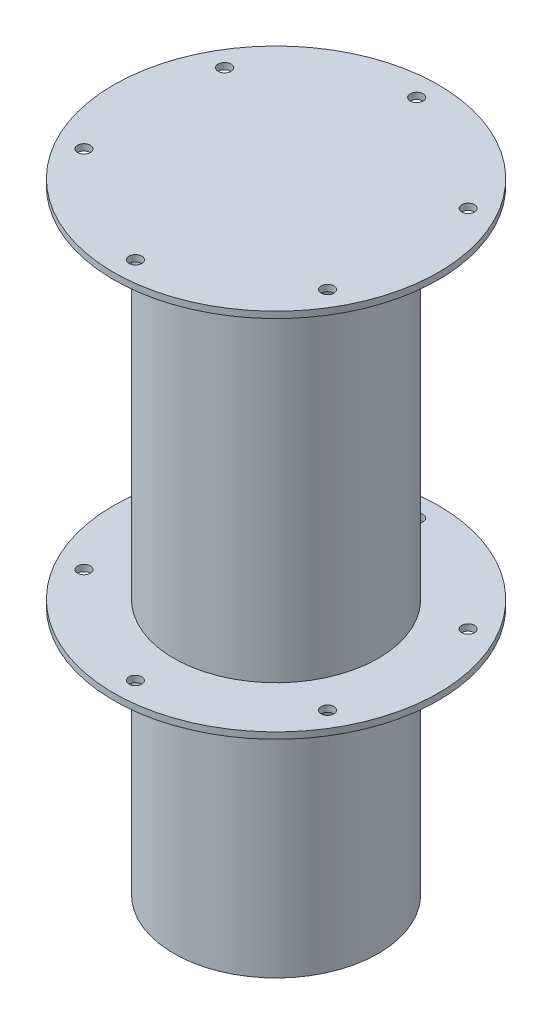
ISO-10303-21;
HEADER;
FILE_DESCRIPTION(('STEP AP214'),'2;1');
FILE_NAME('part.step','',(''),(''),'','','');
FILE_SCHEMA(('AUTOMOTIVE_DESIGN { 1 0 10303 214 1 1 1 1 }'));
ENDSEC;
DATA;
#1=APPLICATION_CONTEXT('core data for automotive mechanical design processes');
#2=APPLICATION_PROTOCOL_DEFINITION('international standard','automotive_design',2000,#1);
#3=PRODUCT_CONTEXT('',#1,'mechanical');
#4=PRODUCT('Part','Part','',(#3));
#5=PRODUCT_RELATED_PRODUCT_CATEGORY('part','',(#4));
#6=PRODUCT_DEFINITION_FORMATION('','',#4);
#7=PRODUCT_DEFINITION_CONTEXT('part definition',#1,'design');
#8=PRODUCT_DEFINITION('design','',#6,#7);
#9=PRODUCT_DEFINITION_SHAPE('','',#8);
#10=(LENGTH_UNIT() NAMED_UNIT(*) SI_UNIT(.MILLI.,.METRE.));
#11=(NAMED_UNIT(*) PLANE_ANGLE_UNIT() SI_UNIT($,.RADIAN.));
#12=(NAMED_UNIT(*) SI_UNIT($,.STERADIAN.) SOLID_ANGLE_UNIT());
#13=UNCERTAINTY_MEASURE_WITH_UNIT(LENGTH_MEASURE(1.E-05),#10,'distance_accuracy_value','');
#14=(GEOMETRIC_REPRESENTATION_CONTEXT(3) GLOBAL_UNCERTAINTY_ASSIGNED_CONTEXT((#13)) GLOBAL_UNIT_ASSIGNED_CONTEXT((#10,
#11,#12)) REPRESENTATION_CONTEXT('',''));
#15=CARTESIAN_POINT('',(0.,0.,0.));
#16=DIRECTION('',(0.,0.,1.));
#17=DIRECTION('',(1.,0.,0.));
#18=AXIS2_PLACEMENT_3D('',#15,#16,#17);
#19=CARTESIAN_POINT('',(0.,324.959176799148,0.));
#20=DIRECTION('',(0.,-1.,0.));
#21=DIRECTION('',(1.,0.,0.));
#22=AXIS2_PLACEMENT_3D('',#19,#20,#21);
#23=PLANE('',#22);
#24=CARTESIAN_POINT('',(120.983748908698,324.959176799148,69.8499999999931));
#25=DIRECTION('',(0.,1.,0.));
#26=DIRECTION('',(-1.,0.,0.));
#27=AXIS2_PLACEMENT_3D('',#24,#25,#26);
#28=CIRCLE('',#27,6.35000000001);
#29=CARTESIAN_POINT('',(114.633748908688,324.959176799148,69.8499999999931));
#30=VERTEX_POINT('',#29);
#31=EDGE_CURVE('E157',#30,#30,#28,.T.);
#32=ORIENTED_EDGE('',*,*,#31,.F.);
#33=EDGE_LOOP('',(#32));
#34=FACE_BOUND('',#33,.T.);
#35=CARTESIAN_POINT('',(1.58080385765695E-11,324.959176799148,139.7));
#36=DIRECTION('',(0.,1.,0.));
#37=DIRECTION('',(-1.,0.,0.));
#38=AXIS2_PLACEMENT_3D('',#35,#36,#37);
#39=CIRCLE('',#38,6.35000000001608);
#40=CARTESIAN_POINT('',(-6.35000000000027,324.959176799148,139.7));
#41=VERTEX_POINT('',#40);
#42=EDGE_CURVE('E70',#41,#41,#39,.T.);
#43=ORIENTED_EDGE('',*,*,#42,.F.);
#44=EDGE_LOOP('',(#43));
#45=FACE_BOUND('',#44,.T.);
#46=CARTESIAN_POINT('',(-120.983748908674,324.959176799148,69.8500000000069));
#47=DIRECTION('',(0.,1.,0.));
#48=DIRECTION('',(-1.,0.,0.));
#49=AXIS2_PLACEMENT_3D('',#46,#47,#48);
#50=CIRCLE('',#49,6.35000000001463);
#51=CARTESIAN_POINT('',(-127.333748908689,324.959176799148,69.8500000000069));
#52=VERTEX_POINT('',#51);
#53=EDGE_CURVE('E66',#52,#52,#50,.T.);
#54=ORIENTED_EDGE('',*,*,#53,.F.);
#55=EDGE_LOOP('',(#54));
#56=FACE_BOUND('',#55,.T.);
#57=CARTESIAN_POINT('',(0.,324.959176799148,-139.7));
#58=DIRECTION('',(0.,1.,0.));
#59=DIRECTION('',(-1.,0.,0.));
#60=AXIS2_PLACEMENT_3D('',#57,#58,#59);
#61=CIRCLE('',#60,6.35);
#62=CARTESIAN_POINT('',(-6.35000000000004,324.959176799148,-139.7));
#63=VERTEX_POINT('',#62);
#64=EDGE_CURVE('E62',#63,#63,#61,.T.);
#65=ORIENTED_EDGE('',*,*,#64,.F.);
#66=EDGE_LOOP('',(#65));
#67=FACE_BOUND('',#66,.T.);
#68=CARTESIAN_POINT('',(120.98374890869,324.959176799148,-69.8500000000069));
#69=DIRECTION('',(0.,1.,0.));
#70=DIRECTION('',(-1.,0.,0.));
#71=AXIS2_PLACEMENT_3D('',#68,#69,#70);
#72=CIRCLE('',#71,6.35000000000213);
#73=CARTESIAN_POINT('',(114.633748908688,324.959176799148,-69.8500000000069));
#74=VERTEX_POINT('',#73);
#75=EDGE_CURVE('E57',#74,#74,#72,.T.);
#76=ORIENTED_EDGE('',*,*,#75,.F.);
#77=EDGE_LOOP('',(#76));
#78=FACE_BOUND('',#77,.T.);
#79=CARTESIAN_POINT('',(-120.983748908682,324.959176799148,-69.849999999993));
#80=DIRECTION('',(0.,1.,0.));
#81=DIRECTION('',(-1.,0.,0.));
#82=AXIS2_PLACEMENT_3D('',#79,#80,#81);
#83=CIRCLE('',#82,6.35000000000746);
#84=CARTESIAN_POINT('',(-127.33374890869,324.959176799148,-69.849999999993));
#85=VERTEX_POINT('',#84);
#86=EDGE_CURVE('E52',#85,#85,#83,.T.);
#87=ORIENTED_EDGE('',*,*,#86,.F.);
#88=EDGE_LOOP('',(#87));
#89=FACE_BOUND('',#88,.T.);
#90=CARTESIAN_POINT('',(0.,324.959176799149,0.));
#91=DIRECTION('',(0.,1.,0.));
#92=DIRECTION('',(-1.,0.,0.));
#93=AXIS2_PLACEMENT_3D('',#90,#91,#92);
#94=CIRCLE('',#93,161.358198728357);
#95=CARTESIAN_POINT('',(-161.358198728357,324.959176799149,0.));
#96=VERTEX_POINT('',#95);
#97=EDGE_CURVE('E116',#96,#96,#94,.T.);
#98=ORIENTED_EDGE('',*,*,#97,.T.);
#99=EDGE_LOOP('',(#98));
#100=FACE_BOUND('',#99,.T.);
#101=ADVANCED_FACE('F32',(#34,#45,#56,#67,#78,#89,#100),#23,.F.);
#102=CARTESIAN_POINT('',(-1.58988539307192E-13,-290.990823200851,0.));
#103=DIRECTION('',(0.,-1.,0.));
#104=DIRECTION('',(1.,0.,0.));
#105=AXIS2_PLACEMENT_3D('',#102,#103,#104);
#106=PLANE('',#105);
#107=CARTESIAN_POINT('',(0.,-290.990823200851,0.));
#108=DIRECTION('',(0.,1.,0.));
#109=DIRECTION('',(-1.,0.,0.));
#110=AXIS2_PLACEMENT_3D('',#107,#108,#109);
#111=CIRCLE('',#110,101.6);
#112=CARTESIAN_POINT('',(-101.6,-290.990823200851,0.));
#113=VERTEX_POINT('',#112);
#114=EDGE_CURVE('E10',#113,#113,#111,.T.);
#115=ORIENTED_EDGE('',*,*,#114,.F.);
#116=EDGE_LOOP('',(#115));
#117=FACE_BOUND('',#116,.T.);
#118=ADVANCED_FACE('F144',(#117),#106,.T.);
#119=CARTESIAN_POINT('',(0.,318.609176799148,0.));
#120=DIRECTION('',(0.,1.,0.));
#121=DIRECTION('',(-1.,0.,0.));
#122=AXIS2_PLACEMENT_3D('',#119,#120,#121);
#123=CYLINDRICAL_SURFACE('',#122,101.6);
#124=ORIENTED_EDGE('',*,*,#114,.T.);
#125=EDGE_LOOP('',(#124));
#126=FACE_BOUND('',#125,.T.);
#127=CARTESIAN_POINT('',(0.,-43.3408232008515,0.));
#128=DIRECTION('',(0.,1.,0.));
#129=DIRECTION('',(-1.,0.,0.));
#130=AXIS2_PLACEMENT_3D('',#127,#128,#129);
#131=CIRCLE('',#130,101.6);
#132=CARTESIAN_POINT('',(-101.6,-43.3408232008515,0.));
#133=VERTEX_POINT('',#132);
#134=EDGE_CURVE('E39',#133,#133,#131,.T.);
#135=ORIENTED_EDGE('',*,*,#134,.F.);
#136=EDGE_LOOP('',(#135));
#137=FACE_BOUND('',#136,.T.);
#138=ADVANCED_FACE('F138',(#126,#137),#123,.T.);
#139=CARTESIAN_POINT('',(0.,-43.3408232008515,0.));
#140=DIRECTION('',(0.,1.,0.));
#141=DIRECTION('',(-1.,0.,0.));
#142=AXIS2_PLACEMENT_3D('',#139,#140,#141);
#143=PLANE('',#142);
#144=CARTESIAN_POINT('',(120.983748908698,-43.3408232008515,69.8499999999931));
#145=DIRECTION('',(0.,1.,0.));
#146=DIRECTION('',(-1.,0.,0.));
#147=AXIS2_PLACEMENT_3D('',#144,#145,#146);
#148=CIRCLE('',#147,6.35000000001);
#149=CARTESIAN_POINT('',(114.633748908688,-43.3408232008515,69.8499999999931));
#150=VERTEX_POINT('',#149);
#151=EDGE_CURVE('E77',#150,#150,#148,.T.);
#152=ORIENTED_EDGE('',*,*,#151,.T.);
#153=EDGE_LOOP('',(#152));
#154=FACE_BOUND('',#153,.T.);
#155=CARTESIAN_POINT('',(1.58531423181821E-11,-43.3408232008515,139.7));
#156=DIRECTION('',(0.,1.,0.));
#157=DIRECTION('',(-1.,0.,0.));
#158=AXIS2_PLACEMENT_3D('',#155,#156,#157);
#159=CIRCLE('',#158,6.35000000001608);
#160=CARTESIAN_POINT('',(-6.35000000000023,-43.3408232008515,139.7));
#161=VERTEX_POINT('',#160);
#162=EDGE_CURVE('E74',#161,#161,#159,.T.);
#163=ORIENTED_EDGE('',*,*,#162,.T.);
#164=EDGE_LOOP('',(#163));
#165=FACE_BOUND('',#164,.T.);
#166=CARTESIAN_POINT('',(-120.983748908674,-43.3408232008515,69.8500000000069));
#167=DIRECTION('',(0.,1.,0.));
#168=DIRECTION('',(-1.,0.,0.));
#169=AXIS2_PLACEMENT_3D('',#166,#167,#168);
#170=CIRCLE('',#169,6.35000000001463);
#171=CARTESIAN_POINT('',(-127.333748908689,-43.3408232008515,69.8500000000069));
#172=VERTEX_POINT('',#171);
#173=EDGE_CURVE('E92',#172,#172,#170,.T.);
#174=ORIENTED_EDGE('',*,*,#173,.T.);
#175=EDGE_LOOP('',(#174));
#176=FACE_BOUND('',#175,.T.);
#177=CARTESIAN_POINT('',(0.,-43.3408232008515,-139.7));
#178=DIRECTION('',(0.,1.,0.));
#179=DIRECTION('',(-1.,0.,0.));
#180=AXIS2_PLACEMENT_3D('',#177,#178,#179);
#181=CIRCLE('',#180,6.35);
#182=CARTESIAN_POINT('',(-6.34999999999999,-43.3408232008515,-139.7));
#183=VERTEX_POINT('',#182);
#184=EDGE_CURVE('E99',#183,#183,#181,.T.);
#185=ORIENTED_EDGE('',*,*,#184,.T.);
#186=EDGE_LOOP('',(#185));
#187=FACE_BOUND('',#186,.T.);
#188=CARTESIAN_POINT('',(120.98374890869,-43.3408232008515,-69.8500000000069));
#189=DIRECTION('',(0.,1.,0.));
#190=DIRECTION('',(-1.,0.,0.));
#191=AXIS2_PLACEMENT_3D('',#188,#189,#190);
#192=CIRCLE('',#191,6.35000000000213);
#193=CARTESIAN_POINT('',(114.633748908688,-43.3408232008515,-69.8500000000069));
#194=VERTEX_POINT('',#193);
#195=EDGE_CURVE('E106',#194,#194,#192,.T.);
#196=ORIENTED_EDGE('',*,*,#195,.T.);
#197=EDGE_LOOP('',(#196));
#198=FACE_BOUND('',#197,.T.);
#199=CARTESIAN_POINT('',(-120.983748908682,-43.3408232008515,-69.849999999993));
#200=DIRECTION('',(0.,1.,0.));
#201=DIRECTION('',(-1.,0.,0.));
#202=AXIS2_PLACEMENT_3D('',#199,#200,#201);
#203=CIRCLE('',#202,6.35000000000746);
#204=CARTESIAN_POINT('',(-127.33374890869,-43.3408232008515,-69.849999999993));
#205=VERTEX_POINT('',#204);
#206=EDGE_CURVE('E113',#205,#205,#203,.T.);
#207=ORIENTED_EDGE('',*,*,#206,.T.);
#208=EDGE_LOOP('',(#207));
#209=FACE_BOUND('',#208,.T.);
#210=CARTESIAN_POINT('',(0.,-43.3408232008515,0.));
#211=DIRECTION('',(0.,1.,0.));
#212=DIRECTION('',(-1.,0.,0.));
#213=AXIS2_PLACEMENT_3D('',#210,#211,#212);
#214=CIRCLE('',#213,161.358198728357);
#215=CARTESIAN_POINT('',(-161.358198728357,-43.3408232008515,0.));
#216=VERTEX_POINT('',#215);
#217=EDGE_CURVE('E44',#216,#216,#214,.T.);
#218=ORIENTED_EDGE('',*,*,#217,.F.);
#219=EDGE_LOOP('',(#218));
#220=FACE_BOUND('',#219,.T.);
#221=ORIENTED_EDGE('',*,*,#134,.T.);
#222=EDGE_LOOP('',(#221));
#223=FACE_BOUND('',#222,.T.);
#224=ADVANCED_FACE('F135',(#154,#165,#176,#187,#198,#209,#220,#223),#143,.F.);
#225=CARTESIAN_POINT('',(0.,318.609176799148,0.));
#226=DIRECTION('',(0.,1.,0.));
#227=DIRECTION('',(-1.,0.,0.));
#228=AXIS2_PLACEMENT_3D('',#225,#226,#227);
#229=CYLINDRICAL_SURFACE('',#228,161.358198728357);
#230=CARTESIAN_POINT('',(0.,-36.9908232008515,0.));
#231=DIRECTION('',(0.,1.,0.));
#232=DIRECTION('',(-1.,0.,0.));
#233=AXIS2_PLACEMENT_3D('',#230,#231,#232);
#234=CIRCLE('',#233,161.358198728357);
#235=CARTESIAN_POINT('',(-161.358198728357,-36.9908232008515,0.));
#236=VERTEX_POINT('',#235);
#237=EDGE_CURVE('E128',#236,#236,#234,.T.);
#238=ORIENTED_EDGE('',*,*,#237,.F.);
#239=EDGE_LOOP('',(#238));
#240=FACE_BOUND('',#239,.T.);
#241=ORIENTED_EDGE('',*,*,#217,.T.);
#242=EDGE_LOOP('',(#241));
#243=FACE_BOUND('',#242,.T.);
#244=ADVANCED_FACE('F133',(#240,#243),#229,.T.);
#245=CARTESIAN_POINT('',(0.,-36.9908232008515,0.));
#246=DIRECTION('',(0.,-1.,0.));
#247=DIRECTION('',(1.,0.,0.));
#248=AXIS2_PLACEMENT_3D('',#245,#246,#247);
#249=PLANE('',#248);
#250=CARTESIAN_POINT('',(120.983748908698,-36.9908232008515,69.8499999999931));
#251=DIRECTION('',(0.,-1.,0.));
#252=DIRECTION('',(1.,0.,0.));
#253=AXIS2_PLACEMENT_3D('',#250,#251,#252);
#254=CIRCLE('',#253,6.35000000001);
#255=CARTESIAN_POINT('',(127.333748908708,-36.9908232008515,69.8499999999931));
#256=VERTEX_POINT('',#255);
#257=EDGE_CURVE('E82',#256,#256,#254,.T.);
#258=ORIENTED_EDGE('',*,*,#257,.T.);
#259=EDGE_LOOP('',(#258));
#260=FACE_BOUND('',#259,.T.);
#261=CARTESIAN_POINT('',(1.58523646674647E-11,-36.9908232008515,139.7));
#262=DIRECTION('',(0.,-1.,0.));
#263=DIRECTION('',(1.,0.,0.));
#264=AXIS2_PLACEMENT_3D('',#261,#262,#263);
#265=CIRCLE('',#264,6.35000000001608);
#266=CARTESIAN_POINT('',(6.35000000003193,-36.9908232008515,139.7));
#267=VERTEX_POINT('',#266);
#268=EDGE_CURVE('E69',#267,#267,#265,.T.);
#269=ORIENTED_EDGE('',*,*,#268,.T.);
#270=EDGE_LOOP('',(#269));
#271=FACE_BOUND('',#270,.T.);
#272=CARTESIAN_POINT('',(-120.983748908674,-36.9908232008515,69.8500000000069));
#273=DIRECTION('',(0.,-1.,0.));
#274=DIRECTION('',(1.,0.,0.));
#275=AXIS2_PLACEMENT_3D('',#272,#273,#274);
#276=CIRCLE('',#275,6.35000000001463);
#277=CARTESIAN_POINT('',(-114.63374890866,-36.9908232008515,69.8500000000069));
#278=VERTEX_POINT('',#277);
#279=EDGE_CURVE('E65',#278,#278,#276,.T.);
#280=ORIENTED_EDGE('',*,*,#279,.T.);
#281=EDGE_LOOP('',(#280));
#282=FACE_BOUND('',#281,.T.);
#283=CARTESIAN_POINT('',(0.,-36.9908232008515,-139.7));
#284=DIRECTION('',(0.,-1.,0.));
#285=DIRECTION('',(1.,0.,0.));
#286=AXIS2_PLACEMENT_3D('',#283,#284,#285);
#287=CIRCLE('',#286,6.35);
#288=CARTESIAN_POINT('',(6.35,-36.9908232008515,-139.7));
#289=VERTEX_POINT('',#288);
#290=EDGE_CURVE('E61',#289,#289,#287,.T.);
#291=ORIENTED_EDGE('',*,*,#290,.T.);
#292=EDGE_LOOP('',(#291));
#293=FACE_BOUND('',#292,.T.);
#294=CARTESIAN_POINT('',(120.98374890869,-36.9908232008515,-69.8500000000069));
#295=DIRECTION('',(0.,-1.,0.));
#296=DIRECTION('',(1.,0.,0.));
#297=AXIS2_PLACEMENT_3D('',#294,#295,#296);
#298=CIRCLE('',#297,6.35000000000213);
#299=CARTESIAN_POINT('',(127.333748908692,-36.9908232008515,-69.8500000000069));
#300=VERTEX_POINT('',#299);
#301=EDGE_CURVE('E56',#300,#300,#298,.T.);
#302=ORIENTED_EDGE('',*,*,#301,.T.);
#303=EDGE_LOOP('',(#302));
#304=FACE_BOUND('',#303,.T.);
#305=CARTESIAN_POINT('',(-120.983748908682,-36.9908232008515,-69.849999999993));
#306=DIRECTION('',(0.,-1.,0.));
#307=DIRECTION('',(1.,0.,0.));
#308=AXIS2_PLACEMENT_3D('',#305,#306,#307);
#309=CIRCLE('',#308,6.35000000000746);
#310=CARTESIAN_POINT('',(-114.633748908675,-36.9908232008515,-69.849999999993));
#311=VERTEX_POINT('',#310);
#312=EDGE_CURVE('E51',#311,#311,#309,.T.);
#313=ORIENTED_EDGE('',*,*,#312,.T.);
#314=EDGE_LOOP('',(#313));
#315=FACE_BOUND('',#314,.T.);
#316=CARTESIAN_POINT('',(0.,-36.9908232008515,0.));
#317=DIRECTION('',(0.,1.,0.));
#318=DIRECTION('',(-1.,0.,0.));
#319=AXIS2_PLACEMENT_3D('',#316,#317,#318);
#320=CIRCLE('',#319,101.6);
#321=CARTESIAN_POINT('',(-101.6,-36.9908232008515,0.));
#322=VERTEX_POINT('',#321);
#323=EDGE_CURVE('E125',#322,#322,#320,.T.);
#324=ORIENTED_EDGE('',*,*,#323,.F.);
#325=EDGE_LOOP('',(#324));
#326=FACE_BOUND('',#325,.T.);
#327=ORIENTED_EDGE('',*,*,#237,.T.);
#328=EDGE_LOOP('',(#327));
#329=FACE_BOUND('',#328,.T.);
#330=ADVANCED_FACE('F185',(#260,#271,#282,#293,#304,#315,#326,#329),#249,.F.);
#331=CARTESIAN_POINT('',(0.,318.609176799148,0.));
#332=DIRECTION('',(0.,1.,0.));
#333=DIRECTION('',(-1.,0.,0.));
#334=AXIS2_PLACEMENT_3D('',#331,#332,#333);
#335=CYLINDRICAL_SURFACE('',#334,101.6);
#336=ORIENTED_EDGE('',*,*,#323,.T.);
#337=EDGE_LOOP('',(#336));
#338=FACE_BOUND('',#337,.T.);
#339=CARTESIAN_POINT('',(0.,318.609176799148,0.));
#340=DIRECTION('',(0.,1.,0.));
#341=DIRECTION('',(-1.,0.,0.));
#342=AXIS2_PLACEMENT_3D('',#339,#340,#341);
#343=CIRCLE('',#342,101.6);
#344=CARTESIAN_POINT('',(-101.6,318.609176799148,0.));
#345=VERTEX_POINT('',#344);
#346=EDGE_CURVE('E122',#345,#345,#343,.T.);
#347=ORIENTED_EDGE('',*,*,#346,.F.);
#348=EDGE_LOOP('',(#347));
#349=FACE_BOUND('',#348,.T.);
#350=ADVANCED_FACE('F179',(#338,#349),#335,.T.);
#351=CARTESIAN_POINT('',(0.,318.609176799148,0.));
#352=DIRECTION('',(0.,1.,0.));
#353=DIRECTION('',(-1.,0.,0.));
#354=AXIS2_PLACEMENT_3D('',#351,#352,#353);
#355=PLANE('',#354);
#356=CARTESIAN_POINT('',(120.983748908698,318.609176799148,69.8499999999931));
#357=DIRECTION('',(0.,1.,0.));
#358=DIRECTION('',(-1.,0.,0.));
#359=AXIS2_PLACEMENT_3D('',#356,#357,#358);
#360=CIRCLE('',#359,6.35000000001);
#361=CARTESIAN_POINT('',(114.633748908688,318.609176799148,69.8499999999931));
#362=VERTEX_POINT('',#361);
#363=EDGE_CURVE('E35',#362,#362,#360,.T.);
#364=ORIENTED_EDGE('',*,*,#363,.T.);
#365=EDGE_LOOP('',(#364));
#366=FACE_BOUND('',#365,.T.);
#367=CARTESIAN_POINT('',(1.5808816227287E-11,318.609176799148,139.7));
#368=DIRECTION('',(0.,1.,0.));
#369=DIRECTION('',(-1.,0.,0.));
#370=AXIS2_PLACEMENT_3D('',#367,#368,#369);
#371=CIRCLE('',#370,6.35000000001608);
#372=CARTESIAN_POINT('',(-6.35000000000027,318.609176799148,139.7));
#373=VERTEX_POINT('',#372);
#374=EDGE_CURVE('E67',#373,#373,#371,.T.);
#375=ORIENTED_EDGE('',*,*,#374,.T.);
#376=EDGE_LOOP('',(#375));
#377=FACE_BOUND('',#376,.T.);
#378=CARTESIAN_POINT('',(-120.983748908674,318.609176799148,69.8500000000069));
#379=DIRECTION('',(0.,1.,0.));
#380=DIRECTION('',(-1.,0.,0.));
#381=AXIS2_PLACEMENT_3D('',#378,#379,#380);
#382=CIRCLE('',#381,6.35000000001463);
#383=CARTESIAN_POINT('',(-127.333748908689,318.609176799148,69.8500000000069));
#384=VERTEX_POINT('',#383);
#385=EDGE_CURVE('E63',#384,#384,#382,.T.);
#386=ORIENTED_EDGE('',*,*,#385,.T.);
#387=EDGE_LOOP('',(#386));
#388=FACE_BOUND('',#387,.T.);
#389=CARTESIAN_POINT('',(0.,318.609176799148,-139.7));
#390=DIRECTION('',(0.,1.,0.));
#391=DIRECTION('',(-1.,0.,0.));
#392=AXIS2_PLACEMENT_3D('',#389,#390,#391);
#393=CIRCLE('',#392,6.35);
#394=CARTESIAN_POINT('',(-6.35000000000004,318.609176799148,-139.7));
#395=VERTEX_POINT('',#394);
#396=EDGE_CURVE('E58',#395,#395,#393,.T.);
#397=ORIENTED_EDGE('',*,*,#396,.T.);
#398=EDGE_LOOP('',(#397));
#399=FACE_BOUND('',#398,.T.);
#400=CARTESIAN_POINT('',(120.98374890869,318.609176799148,-69.8500000000069));
#401=DIRECTION('',(0.,1.,0.));
#402=DIRECTION('',(-1.,0.,0.));
#403=AXIS2_PLACEMENT_3D('',#400,#401,#402);
#404=CIRCLE('',#403,6.35000000000213);
#405=CARTESIAN_POINT('',(114.633748908688,318.609176799148,-69.8500000000069));
#406=VERTEX_POINT('',#405);
#407=EDGE_CURVE('E53',#406,#406,#404,.T.);
#408=ORIENTED_EDGE('',*,*,#407,.T.);
#409=EDGE_LOOP('',(#408));
#410=FACE_BOUND('',#409,.T.);
#411=CARTESIAN_POINT('',(-120.983748908682,318.609176799148,-69.849999999993));
#412=DIRECTION('',(0.,1.,0.));
#413=DIRECTION('',(-1.,0.,0.));
#414=AXIS2_PLACEMENT_3D('',#411,#412,#413);
#415=CIRCLE('',#414,6.35000000000746);
#416=CARTESIAN_POINT('',(-127.33374890869,318.609176799148,-69.849999999993));
#417=VERTEX_POINT('',#416);
#418=EDGE_CURVE('E48',#417,#417,#415,.T.);
#419=ORIENTED_EDGE('',*,*,#418,.T.);
#420=EDGE_LOOP('',(#419));
#421=FACE_BOUND('',#420,.T.);
#422=CARTESIAN_POINT('',(0.,318.609176799148,0.));
#423=DIRECTION('',(0.,1.,0.));
#424=DIRECTION('',(-1.,0.,0.));
#425=AXIS2_PLACEMENT_3D('',#422,#423,#424);
#426=CIRCLE('',#425,161.358198728357);
#427=CARTESIAN_POINT('',(-161.358198728357,318.609176799148,0.));
#428=VERTEX_POINT('',#427);
#429=EDGE_CURVE('E119',#428,#428,#426,.T.);
#430=ORIENTED_EDGE('',*,*,#429,.F.);
#431=EDGE_LOOP('',(#430));
#432=FACE_BOUND('',#431,.T.);
#433=ORIENTED_EDGE('',*,*,#346,.T.);
#434=EDGE_LOOP('',(#433));
#435=FACE_BOUND('',#434,.T.);
#436=ADVANCED_FACE('F173',(#366,#377,#388,#399,#410,#421,#432,#435),#355,.F.);
#437=CARTESIAN_POINT('',(0.,318.609176799148,0.));
#438=DIRECTION('',(0.,1.,0.));
#439=DIRECTION('',(-1.,0.,0.));
#440=AXIS2_PLACEMENT_3D('',#437,#438,#439);
#441=CYLINDRICAL_SURFACE('',#440,161.358198728357);
#442=ORIENTED_EDGE('',*,*,#97,.F.);
#443=EDGE_LOOP('',(#442));
#444=FACE_BOUND('',#443,.T.);
#445=ORIENTED_EDGE('',*,*,#429,.T.);
#446=EDGE_LOOP('',(#445));
#447=FACE_BOUND('',#446,.T.);
#448=ADVANCED_FACE('F169',(#444,#447),#441,.T.);
#449=CARTESIAN_POINT('',(-120.983748908682,-290.990823200851,-69.849999999993));
#450=DIRECTION('',(0.,1.,0.));
#451=DIRECTION('',(-1.,0.,0.));
#452=AXIS2_PLACEMENT_3D('',#449,#450,#451);
#453=CYLINDRICAL_SURFACE('',#452,6.35000000000746);
#454=ORIENTED_EDGE('',*,*,#86,.T.);
#455=EDGE_LOOP('',(#454));
#456=FACE_BOUND('',#455,.T.);
#457=ORIENTED_EDGE('',*,*,#418,.F.);
#458=EDGE_LOOP('',(#457));
#459=FACE_BOUND('',#458,.T.);
#460=ADVANCED_FACE('F172',(#456,#459),#453,.F.);
#461=ORIENTED_EDGE('',*,*,#312,.F.);
#462=EDGE_LOOP('',(#461));
#463=FACE_BOUND('',#462,.T.);
#464=ORIENTED_EDGE('',*,*,#206,.F.);
#465=EDGE_LOOP('',(#464));
#466=FACE_BOUND('',#465,.T.);
#467=ADVANCED_FACE('F225',(#463,#466),#453,.F.);
#468=CARTESIAN_POINT('',(120.98374890869,-290.990823200851,-69.8500000000069));
#469=DIRECTION('',(0.,1.,0.));
#470=DIRECTION('',(-1.,0.,0.));
#471=AXIS2_PLACEMENT_3D('',#468,#469,#470);
#472=CYLINDRICAL_SURFACE('',#471,6.35000000000213);
#473=ORIENTED_EDGE('',*,*,#75,.T.);
#474=EDGE_LOOP('',(#473));
#475=FACE_BOUND('',#474,.T.);
#476=ORIENTED_EDGE('',*,*,#407,.F.);
#477=EDGE_LOOP('',(#476));
#478=FACE_BOUND('',#477,.T.);
#479=ADVANCED_FACE('F235',(#475,#478),#472,.F.);
#480=ORIENTED_EDGE('',*,*,#301,.F.);
#481=EDGE_LOOP('',(#480));
#482=FACE_BOUND('',#481,.T.);
#483=ORIENTED_EDGE('',*,*,#195,.F.);
#484=EDGE_LOOP('',(#483));
#485=FACE_BOUND('',#484,.T.);
#486=ADVANCED_FACE('F244',(#482,#485),#472,.F.);
#487=CARTESIAN_POINT('',(0.,-290.990823200851,-139.7));
#488=DIRECTION('',(0.,1.,0.));
#489=DIRECTION('',(-1.,0.,0.));
#490=AXIS2_PLACEMENT_3D('',#487,#488,#489);
#491=CYLINDRICAL_SURFACE('',#490,6.35);
#492=ORIENTED_EDGE('',*,*,#64,.T.);
#493=EDGE_LOOP('',(#492));
#494=FACE_BOUND('',#493,.T.);
#495=ORIENTED_EDGE('',*,*,#396,.F.);
#496=EDGE_LOOP('',(#495));
#497=FACE_BOUND('',#496,.T.);
#498=ADVANCED_FACE('F254',(#494,#497),#491,.F.);
#499=ORIENTED_EDGE('',*,*,#290,.F.);
#500=EDGE_LOOP('',(#499));
#501=FACE_BOUND('',#500,.T.);
#502=ORIENTED_EDGE('',*,*,#184,.F.);
#503=EDGE_LOOP('',(#502));
#504=FACE_BOUND('',#503,.T.);
#505=ADVANCED_FACE('F263',(#501,#504),#491,.F.);
#506=CARTESIAN_POINT('',(-120.983748908674,-290.990823200851,69.8500000000069));
#507=DIRECTION('',(0.,1.,0.));
#508=DIRECTION('',(-1.,0.,0.));
#509=AXIS2_PLACEMENT_3D('',#506,#507,#508);
#510=CYLINDRICAL_SURFACE('',#509,6.35000000001463);
#511=ORIENTED_EDGE('',*,*,#53,.T.);
#512=EDGE_LOOP('',(#511));
#513=FACE_BOUND('',#512,.T.);
#514=ORIENTED_EDGE('',*,*,#385,.F.);
#515=EDGE_LOOP('',(#514));
#516=FACE_BOUND('',#515,.T.);
#517=ADVANCED_FACE('F273',(#513,#516),#510,.F.);
#518=ORIENTED_EDGE('',*,*,#279,.F.);
#519=EDGE_LOOP('',(#518));
#520=FACE_BOUND('',#519,.T.);
#521=ORIENTED_EDGE('',*,*,#173,.F.);
#522=EDGE_LOOP('',(#521));
#523=FACE_BOUND('',#522,.T.);
#524=ADVANCED_FACE('F282',(#520,#523),#510,.F.);
#525=CARTESIAN_POINT('',(1.5883470696163E-11,-290.990823200851,139.7));
#526=DIRECTION('',(0.,1.,0.));
#527=DIRECTION('',(-1.,0.,0.));
#528=AXIS2_PLACEMENT_3D('',#525,#526,#527);
#529=CYLINDRICAL_SURFACE('',#528,6.35000000001608);
#530=ORIENTED_EDGE('',*,*,#42,.T.);
#531=EDGE_LOOP('',(#530));
#532=FACE_BOUND('',#531,.T.);
#533=ORIENTED_EDGE('',*,*,#374,.F.);
#534=EDGE_LOOP('',(#533));
#535=FACE_BOUND('',#534,.T.);
#536=ADVANCED_FACE('F292',(#532,#535),#529,.F.);
#537=ORIENTED_EDGE('',*,*,#268,.F.);
#538=EDGE_LOOP('',(#537));
#539=FACE_BOUND('',#538,.T.);
#540=ORIENTED_EDGE('',*,*,#162,.F.);
#541=EDGE_LOOP('',(#540));
#542=FACE_BOUND('',#541,.T.);
#543=ADVANCED_FACE('F301',(#539,#542),#529,.F.);
#544=CARTESIAN_POINT('',(120.983748908698,-290.990823200851,69.8499999999931));
#545=DIRECTION('',(0.,1.,0.));
#546=DIRECTION('',(-1.,0.,0.));
#547=AXIS2_PLACEMENT_3D('',#544,#545,#546);
#548=CYLINDRICAL_SURFACE('',#547,6.35000000001);
#549=ORIENTED_EDGE('',*,*,#31,.T.);
#550=EDGE_LOOP('',(#549));
#551=FACE_BOUND('',#550,.T.);
#552=ORIENTED_EDGE('',*,*,#363,.F.);
#553=EDGE_LOOP('',(#552));
#554=FACE_BOUND('',#553,.T.);
#555=ADVANCED_FACE('F310',(#551,#554),#548,.F.);
#556=ORIENTED_EDGE('',*,*,#257,.F.);
#557=EDGE_LOOP('',(#556));
#558=FACE_BOUND('',#557,.T.);
#559=ORIENTED_EDGE('',*,*,#151,.F.);
#560=EDGE_LOOP('',(#559));
#561=FACE_BOUND('',#560,.T.);
#562=ADVANCED_FACE('F319',(#558,#561),#548,.F.);
#563=CLOSED_SHELL('',(#101,#118,#138,#224,#244,#330,#350,#436,#448,#460,#467,#479,#486,#498,
#505,#517,#524,#536,#543,#555,#562));
#564=MANIFOLD_SOLID_BREP('B2',#563);
#565=ADVANCED_BREP_SHAPE_REPRESENTATION('',(#18,#564),#14);
#566=SHAPE_DEFINITION_REPRESENTATION(#9,#565);
ENDSEC;
END-ISO-10303-21;
